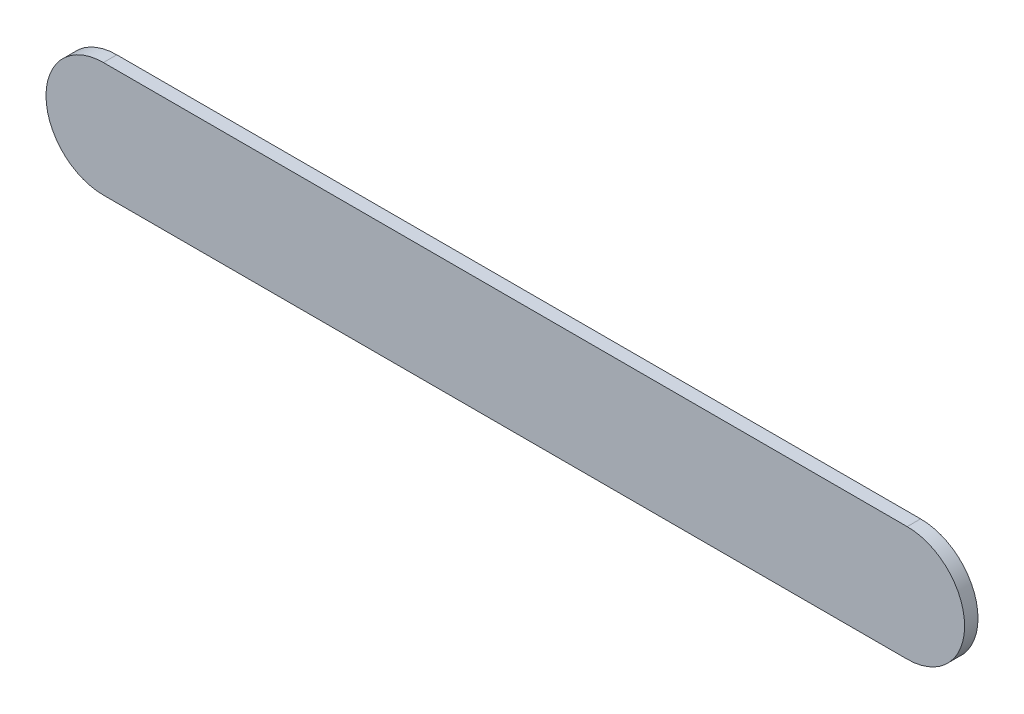
ISO-10303-21;
HEADER;
FILE_DESCRIPTION(('STEP AP214'),'2;1');
FILE_NAME('part.step','',(''),(''),'','','');
FILE_SCHEMA(('AUTOMOTIVE_DESIGN { 1 0 10303 214 1 1 1 1 }'));
ENDSEC;
DATA;
#1=APPLICATION_CONTEXT('core data for automotive mechanical design processes');
#2=APPLICATION_PROTOCOL_DEFINITION('international standard','automotive_design',2000,#1);
#3=PRODUCT_CONTEXT('',#1,'mechanical');
#4=PRODUCT('Part','Part','',(#3));
#5=PRODUCT_RELATED_PRODUCT_CATEGORY('part','',(#4));
#6=PRODUCT_DEFINITION_FORMATION('','',#4);
#7=PRODUCT_DEFINITION_CONTEXT('part definition',#1,'design');
#8=PRODUCT_DEFINITION('design','',#6,#7);
#9=PRODUCT_DEFINITION_SHAPE('','',#8);
#10=(LENGTH_UNIT() NAMED_UNIT(*) SI_UNIT(.MILLI.,.METRE.));
#11=(NAMED_UNIT(*) PLANE_ANGLE_UNIT() SI_UNIT($,.RADIAN.));
#12=(NAMED_UNIT(*) SI_UNIT($,.STERADIAN.) SOLID_ANGLE_UNIT());
#13=UNCERTAINTY_MEASURE_WITH_UNIT(LENGTH_MEASURE(1.E-05),#10,'distance_accuracy_value','');
#14=(GEOMETRIC_REPRESENTATION_CONTEXT(3) GLOBAL_UNCERTAINTY_ASSIGNED_CONTEXT((#13)) GLOBAL_UNIT_ASSIGNED_CONTEXT((#10,
#11,#12)) REPRESENTATION_CONTEXT('',''));
#15=CARTESIAN_POINT('',(0.,0.,0.));
#16=DIRECTION('',(0.,0.,1.));
#17=DIRECTION('',(1.,0.,0.));
#18=AXIS2_PLACEMENT_3D('',#15,#16,#17);
#19=CARTESIAN_POINT('',(121.53,-64.33,1.635));
#20=DIRECTION('',(0.,0.,1.));
#21=DIRECTION('',(1.,0.,0.));
#22=AXIS2_PLACEMENT_3D('',#19,#20,#21);
#23=PLANE('',#22);
#24=DIRECTION('',(-1.,0.,0.));
#25=VECTOR('',#24,1.);
#26=CARTESIAN_POINT('',(121.53,-64.33,1.635));
#27=LINE('',#26,#25);
#28=CARTESIAN_POINT('',(121.53,-64.33,1.635));
#29=VERTEX_POINT('',#28);
#30=CARTESIAN_POINT('',(119.43,-64.33,1.635));
#31=VERTEX_POINT('',#30);
#32=EDGE_CURVE('E102',#29,#31,#27,.T.);
#33=ORIENTED_EDGE('',*,*,#32,.T.);
#34=CARTESIAN_POINT('',(119.43,-64.48,1.635));
#35=DIRECTION('',(0.,0.,1.));
#36=DIRECTION('',(0.,1.,0.));
#37=AXIS2_PLACEMENT_3D('',#34,#35,#36);
#38=CIRCLE('',#37,0.15);
#39=CARTESIAN_POINT('',(119.43,-64.63,1.635));
#40=VERTEX_POINT('',#39);
#41=EDGE_CURVE('E59',#31,#40,#38,.T.);
#42=ORIENTED_EDGE('',*,*,#41,.T.);
#43=DIRECTION('',(1.,0.,0.));
#44=VECTOR('',#43,1.);
#45=CARTESIAN_POINT('',(119.43,-64.63,1.635));
#46=LINE('',#45,#44);
#47=CARTESIAN_POINT('',(121.53,-64.63,1.635));
#48=VERTEX_POINT('',#47);
#49=EDGE_CURVE('E88',#40,#48,#46,.T.);
#50=ORIENTED_EDGE('',*,*,#49,.T.);
#51=CARTESIAN_POINT('',(121.53,-64.48,1.635));
#52=DIRECTION('',(0.,0.,1.));
#53=DIRECTION('',(0.,-1.,0.));
#54=AXIS2_PLACEMENT_3D('',#51,#52,#53);
#55=CIRCLE('',#54,0.15);
#56=EDGE_CURVE('E11',#48,#29,#55,.T.);
#57=ORIENTED_EDGE('',*,*,#56,.T.);
#58=EDGE_LOOP('',(#33,#42,#50,#57));
#59=FACE_BOUND('',#58,.T.);
#60=ADVANCED_FACE('F17',(#59),#23,.T.);
#61=CARTESIAN_POINT('',(121.53,-64.33,1.6));
#62=DIRECTION('',(0.,0.,1.));
#63=DIRECTION('',(1.,0.,0.));
#64=AXIS2_PLACEMENT_3D('',#61,#62,#63);
#65=PLANE('',#64);
#66=CARTESIAN_POINT('',(121.53,-64.48,1.6));
#67=DIRECTION('',(0.,0.,1.));
#68=DIRECTION('',(0.,-1.,0.));
#69=AXIS2_PLACEMENT_3D('',#66,#67,#68);
#70=CIRCLE('',#69,0.15);
#71=CARTESIAN_POINT('',(121.53,-64.63,1.6));
#72=VERTEX_POINT('',#71);
#73=CARTESIAN_POINT('',(121.53,-64.33,1.6));
#74=VERTEX_POINT('',#73);
#75=EDGE_CURVE('E20',#72,#74,#70,.T.);
#76=ORIENTED_EDGE('',*,*,#75,.F.);
#77=DIRECTION('',(1.,0.,0.));
#78=VECTOR('',#77,1.);
#79=CARTESIAN_POINT('',(119.43,-64.63,1.6));
#80=LINE('',#79,#78);
#81=CARTESIAN_POINT('',(119.43,-64.63,1.6));
#82=VERTEX_POINT('',#81);
#83=EDGE_CURVE('E78',#82,#72,#80,.T.);
#84=ORIENTED_EDGE('',*,*,#83,.F.);
#85=CARTESIAN_POINT('',(119.43,-64.48,1.6));
#86=DIRECTION('',(0.,0.,1.));
#87=DIRECTION('',(0.,1.,0.));
#88=AXIS2_PLACEMENT_3D('',#85,#86,#87);
#89=CIRCLE('',#88,0.15);
#90=CARTESIAN_POINT('',(119.43,-64.33,1.6));
#91=VERTEX_POINT('',#90);
#92=EDGE_CURVE('E69',#91,#82,#89,.T.);
#93=ORIENTED_EDGE('',*,*,#92,.F.);
#94=DIRECTION('',(-1.,0.,0.));
#95=VECTOR('',#94,1.);
#96=CARTESIAN_POINT('',(121.53,-64.33,1.6));
#97=LINE('',#96,#95);
#98=EDGE_CURVE('E120',#74,#91,#97,.T.);
#99=ORIENTED_EDGE('',*,*,#98,.F.);
#100=EDGE_LOOP('',(#76,#84,#93,#99));
#101=FACE_BOUND('',#100,.T.);
#102=ADVANCED_FACE('F80',(#101),#65,.F.);
#103=CARTESIAN_POINT('',(121.53,-64.48,1.6));
#104=DIRECTION('',(0.,0.,-1.));
#105=DIRECTION('',(0.,-1.,0.));
#106=AXIS2_PLACEMENT_3D('',#103,#104,#105);
#107=CYLINDRICAL_SURFACE('',#106,0.15);
#108=ORIENTED_EDGE('',*,*,#75,.T.);
#109=DIRECTION('',(0.,0.,1.));
#110=VECTOR('',#109,1.);
#111=CARTESIAN_POINT('',(121.53,-64.33,1.6));
#112=LINE('',#111,#110);
#113=EDGE_CURVE('E96',#74,#29,#112,.T.);
#114=ORIENTED_EDGE('',*,*,#113,.T.);
#115=ORIENTED_EDGE('',*,*,#56,.F.);
#116=DIRECTION('',(0.,0.,1.));
#117=VECTOR('',#116,1.);
#118=CARTESIAN_POINT('',(121.53,-64.63,1.6));
#119=LINE('',#118,#117);
#120=EDGE_CURVE('E84',#72,#48,#119,.T.);
#121=ORIENTED_EDGE('',*,*,#120,.F.);
#122=EDGE_LOOP('',(#108,#114,#115,#121));
#123=FACE_BOUND('',#122,.T.);
#124=ADVANCED_FACE('F127',(#123),#107,.T.);
#125=CARTESIAN_POINT('',(119.43,-64.63,1.6));
#126=DIRECTION('',(0.,1.,0.));
#127=DIRECTION('',(1.,0.,0.));
#128=AXIS2_PLACEMENT_3D('',#125,#126,#127);
#129=PLANE('',#128);
#130=ORIENTED_EDGE('',*,*,#83,.T.);
#131=ORIENTED_EDGE('',*,*,#120,.T.);
#132=ORIENTED_EDGE('',*,*,#49,.F.);
#133=DIRECTION('',(0.,0.,1.));
#134=VECTOR('',#133,1.);
#135=CARTESIAN_POINT('',(119.43,-64.63,1.6));
#136=LINE('',#135,#134);
#137=EDGE_CURVE('E86',#82,#40,#136,.T.);
#138=ORIENTED_EDGE('',*,*,#137,.F.);
#139=EDGE_LOOP('',(#130,#131,#132,#138));
#140=FACE_BOUND('',#139,.T.);
#141=ADVANCED_FACE('F87',(#140),#129,.F.);
#142=CARTESIAN_POINT('',(119.43,-64.48,1.6));
#143=DIRECTION('',(0.,0.,-1.));
#144=DIRECTION('',(0.,1.,0.));
#145=AXIS2_PLACEMENT_3D('',#142,#143,#144);
#146=CYLINDRICAL_SURFACE('',#145,0.15);
#147=ORIENTED_EDGE('',*,*,#92,.T.);
#148=ORIENTED_EDGE('',*,*,#137,.T.);
#149=ORIENTED_EDGE('',*,*,#41,.F.);
#150=DIRECTION('',(0.,0.,1.));
#151=VECTOR('',#150,1.);
#152=CARTESIAN_POINT('',(119.43,-64.33,1.6));
#153=LINE('',#152,#151);
#154=EDGE_CURVE('E93',#91,#31,#153,.T.);
#155=ORIENTED_EDGE('',*,*,#154,.F.);
#156=EDGE_LOOP('',(#147,#148,#149,#155));
#157=FACE_BOUND('',#156,.T.);
#158=ADVANCED_FACE('F91',(#157),#146,.T.);
#159=CARTESIAN_POINT('',(121.53,-64.33,1.6));
#160=DIRECTION('',(0.,-1.,0.));
#161=DIRECTION('',(0.,0.,-1.));
#162=AXIS2_PLACEMENT_3D('',#159,#160,#161);
#163=PLANE('',#162);
#164=ORIENTED_EDGE('',*,*,#98,.T.);
#165=ORIENTED_EDGE('',*,*,#154,.T.);
#166=ORIENTED_EDGE('',*,*,#32,.F.);
#167=ORIENTED_EDGE('',*,*,#113,.F.);
#168=EDGE_LOOP('',(#164,#165,#166,#167));
#169=FACE_BOUND('',#168,.T.);
#170=ADVANCED_FACE('F125',(#169),#163,.F.);
#171=CLOSED_SHELL('',(#60,#102,#124,#141,#158,#170));
#172=MANIFOLD_SOLID_BREP('B1',#171);
#173=ADVANCED_BREP_SHAPE_REPRESENTATION('',(#18,#172),#14);
#174=SHAPE_DEFINITION_REPRESENTATION(#9,#173);
ENDSEC;
END-ISO-10303-21;
